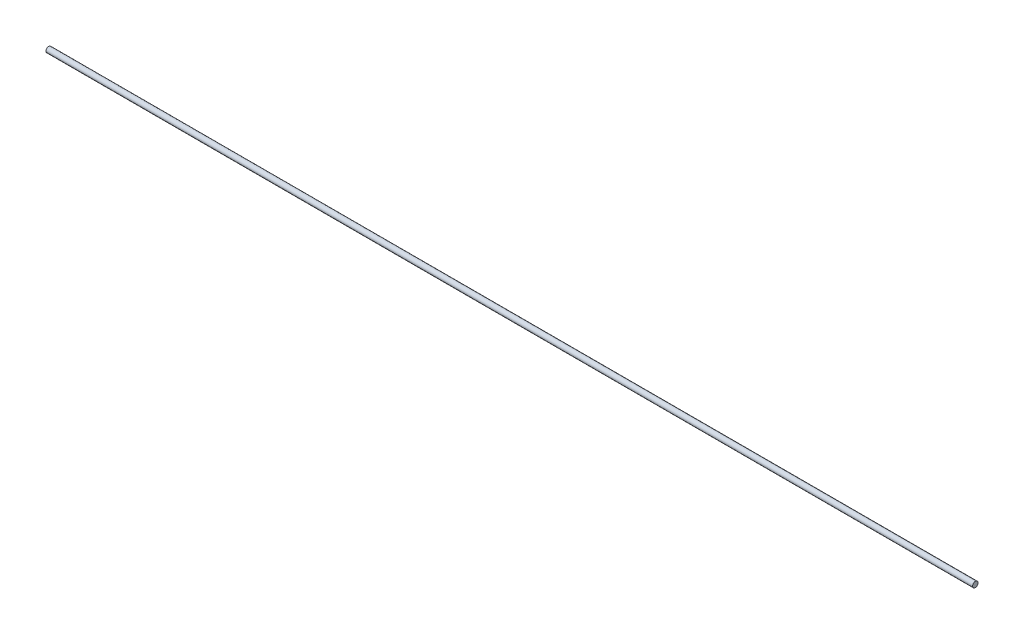
ISO-10303-21;
HEADER;
FILE_DESCRIPTION(('STEP AP214'),'2;1');
FILE_NAME('part.step','',(''),(''),'','','');
FILE_SCHEMA(('AUTOMOTIVE_DESIGN { 1 0 10303 214 1 1 1 1 }'));
ENDSEC;
DATA;
#1=APPLICATION_CONTEXT('core data for automotive mechanical design processes');
#2=APPLICATION_PROTOCOL_DEFINITION('international standard','automotive_design',2000,#1);
#3=PRODUCT_CONTEXT('',#1,'mechanical');
#4=PRODUCT('Part','Part','',(#3));
#5=PRODUCT_RELATED_PRODUCT_CATEGORY('part','',(#4));
#6=PRODUCT_DEFINITION_FORMATION('','',#4);
#7=PRODUCT_DEFINITION_CONTEXT('part definition',#1,'design');
#8=PRODUCT_DEFINITION('design','',#6,#7);
#9=PRODUCT_DEFINITION_SHAPE('','',#8);
#10=(LENGTH_UNIT() NAMED_UNIT(*) SI_UNIT(.MILLI.,.METRE.));
#11=(NAMED_UNIT(*) PLANE_ANGLE_UNIT() SI_UNIT($,.RADIAN.));
#12=(NAMED_UNIT(*) SI_UNIT($,.STERADIAN.) SOLID_ANGLE_UNIT());
#13=UNCERTAINTY_MEASURE_WITH_UNIT(LENGTH_MEASURE(1.E-05),#10,'distance_accuracy_value','');
#14=(GEOMETRIC_REPRESENTATION_CONTEXT(3) GLOBAL_UNCERTAINTY_ASSIGNED_CONTEXT((#13)) GLOBAL_UNIT_ASSIGNED_CONTEXT((#10,
#11,#12)) REPRESENTATION_CONTEXT('',''));
#15=CARTESIAN_POINT('',(0.,0.,0.));
#16=DIRECTION('',(0.,0.,1.));
#17=DIRECTION('',(1.,0.,0.));
#18=AXIS2_PLACEMENT_3D('',#15,#16,#17);
#19=CARTESIAN_POINT('',(0.,0.,0.));
#20=DIRECTION('',(1.,0.,0.));
#21=DIRECTION('',(0.,0.,-1.));
#22=AXIS2_PLACEMENT_3D('',#19,#20,#21);
#23=PLANE('',#22);
#24=CARTESIAN_POINT('',(0.,0.,0.));
#25=DIRECTION('',(1.,0.,0.));
#26=DIRECTION('',(0.,0.,-1.));
#27=AXIS2_PLACEMENT_3D('',#24,#25,#26);
#28=CIRCLE('',#27,1.);
#29=CARTESIAN_POINT('',(0.,0.,-1.));
#30=VERTEX_POINT('',#29);
#31=EDGE_CURVE('E41',#30,#30,#28,.T.);
#32=ORIENTED_EDGE('',*,*,#31,.F.);
#33=EDGE_LOOP('',(#32));
#34=FACE_BOUND('',#33,.T.);
#35=ADVANCED_FACE('F35',(#34),#23,.F.);
#36=CARTESIAN_POINT('',(340.,0.,0.));
#37=DIRECTION('',(1.,0.,0.));
#38=DIRECTION('',(0.,0.,-1.));
#39=AXIS2_PLACEMENT_3D('',#36,#37,#38);
#40=PLANE('',#39);
#41=CARTESIAN_POINT('',(340.,0.,0.));
#42=DIRECTION('',(1.,0.,0.));
#43=DIRECTION('',(0.,0.,-1.));
#44=AXIS2_PLACEMENT_3D('',#41,#42,#43);
#45=CIRCLE('',#44,1.);
#46=CARTESIAN_POINT('',(340.,0.,-1.));
#47=VERTEX_POINT('',#46);
#48=EDGE_CURVE('E10',#47,#47,#45,.T.);
#49=ORIENTED_EDGE('',*,*,#48,.T.);
#50=EDGE_LOOP('',(#49));
#51=FACE_BOUND('',#50,.T.);
#52=ADVANCED_FACE('F50',(#51),#40,.T.);
#53=CARTESIAN_POINT('',(0.,0.,0.));
#54=DIRECTION('',(1.,0.,0.));
#55=DIRECTION('',(0.,0.,-1.));
#56=AXIS2_PLACEMENT_3D('',#53,#54,#55);
#57=CYLINDRICAL_SURFACE('',#56,1.);
#58=ORIENTED_EDGE('',*,*,#48,.F.);
#59=EDGE_LOOP('',(#58));
#60=FACE_BOUND('',#59,.T.);
#61=ORIENTED_EDGE('',*,*,#31,.T.);
#62=EDGE_LOOP('',(#61));
#63=FACE_BOUND('',#62,.T.);
#64=ADVANCED_FACE('F47',(#60,#63),#57,.T.);
#65=CLOSED_SHELL('',(#35,#52,#64));
#66=MANIFOLD_SOLID_BREP('B2',#65);
#67=ADVANCED_BREP_SHAPE_REPRESENTATION('',(#18,#66),#14);
#68=SHAPE_DEFINITION_REPRESENTATION(#9,#67);
ENDSEC;
END-ISO-10303-21;
